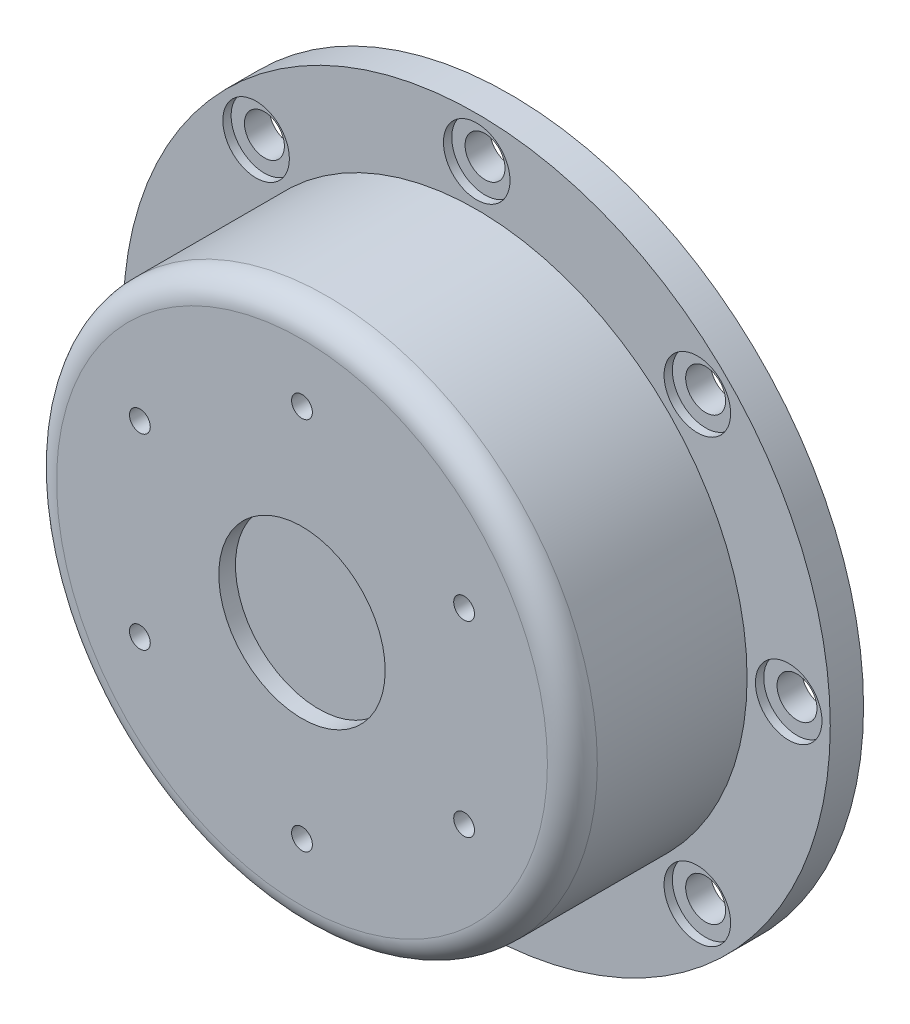
ISO-10303-21;
HEADER;
FILE_DESCRIPTION(('STEP AP214'),'2;1');
FILE_NAME('part.step','',(''),(''),'','','');
FILE_SCHEMA(('AUTOMOTIVE_DESIGN { 1 0 10303 214 1 1 1 1 }'));
ENDSEC;
DATA;
#1=APPLICATION_CONTEXT('core data for automotive mechanical design processes');
#2=APPLICATION_PROTOCOL_DEFINITION('international standard','automotive_design',2000,#1);
#3=PRODUCT_CONTEXT('',#1,'mechanical');
#4=PRODUCT('Part','Part','',(#3));
#5=PRODUCT_RELATED_PRODUCT_CATEGORY('part','',(#4));
#6=PRODUCT_DEFINITION_FORMATION('','',#4);
#7=PRODUCT_DEFINITION_CONTEXT('part definition',#1,'design');
#8=PRODUCT_DEFINITION('design','',#6,#7);
#9=PRODUCT_DEFINITION_SHAPE('','',#8);
#10=(LENGTH_UNIT() NAMED_UNIT(*) SI_UNIT(.MILLI.,.METRE.));
#11=(NAMED_UNIT(*) PLANE_ANGLE_UNIT() SI_UNIT($,.RADIAN.));
#12=(NAMED_UNIT(*) SI_UNIT($,.STERADIAN.) SOLID_ANGLE_UNIT());
#13=UNCERTAINTY_MEASURE_WITH_UNIT(LENGTH_MEASURE(1.E-05),#10,'distance_accuracy_value','');
#14=(GEOMETRIC_REPRESENTATION_CONTEXT(3) GLOBAL_UNCERTAINTY_ASSIGNED_CONTEXT((#13)) GLOBAL_UNIT_ASSIGNED_CONTEXT((#10,
#11,#12)) REPRESENTATION_CONTEXT('',''));
#15=CARTESIAN_POINT('',(0.,0.,0.));
#16=DIRECTION('',(0.,0.,1.));
#17=DIRECTION('',(1.,0.,0.));
#18=AXIS2_PLACEMENT_3D('',#15,#16,#17);
#19=CARTESIAN_POINT('',(0.,0.,25.));
#20=DIRECTION('',(0.,0.,-1.));
#21=DIRECTION('',(-1.,0.,0.));
#22=AXIS2_PLACEMENT_3D('',#19,#20,#21);
#23=CYLINDRICAL_SURFACE('',#22,42.5);
#24=CARTESIAN_POINT('',(0.,0.,0.));
#25=DIRECTION('',(0.,0.,1.));
#26=DIRECTION('',(1.,0.,0.));
#27=AXIS2_PLACEMENT_3D('',#24,#25,#26);
#28=CIRCLE('',#27,42.5);
#29=CARTESIAN_POINT('',(42.5,0.,0.));
#30=VERTEX_POINT('',#29);
#31=EDGE_CURVE('E204',#30,#30,#28,.T.);
#32=ORIENTED_EDGE('',*,*,#31,.T.);
#33=EDGE_LOOP('',(#32));
#34=FACE_BOUND('',#33,.T.);
#35=CARTESIAN_POINT('',(0.,0.,4.));
#36=DIRECTION('',(0.,0.,1.));
#37=DIRECTION('',(1.,0.,0.));
#38=AXIS2_PLACEMENT_3D('',#35,#36,#37);
#39=CIRCLE('',#38,42.5);
#40=CARTESIAN_POINT('',(42.5,0.,4.));
#41=VERTEX_POINT('',#40);
#42=EDGE_CURVE('E203',#41,#41,#39,.T.);
#43=ORIENTED_EDGE('',*,*,#42,.F.);
#44=EDGE_LOOP('',(#43));
#45=FACE_BOUND('',#44,.T.);
#46=ADVANCED_FACE('F42',(#34,#45),#23,.T.);
#47=CARTESIAN_POINT('',(0.,0.,0.));
#48=DIRECTION('',(0.,0.,1.));
#49=DIRECTION('',(1.,0.,0.));
#50=AXIS2_PLACEMENT_3D('',#47,#48,#49);
#51=PLANE('',#50);
#52=CARTESIAN_POINT('',(-26.5165042944952,26.5165042944959,0.));
#53=DIRECTION('',(0.,0.,1.));
#54=DIRECTION('',(1.,0.,0.));
#55=AXIS2_PLACEMENT_3D('',#52,#53,#54);
#56=CIRCLE('',#55,2.4);
#57=CARTESIAN_POINT('',(-24.1165042944952,26.5165042944959,0.));
#58=VERTEX_POINT('',#57);
#59=EDGE_CURVE('E129',#58,#58,#56,.T.);
#60=ORIENTED_EDGE('',*,*,#59,.T.);
#61=EDGE_LOOP('',(#60));
#62=FACE_BOUND('',#61,.T.);
#63=CARTESIAN_POINT('',(-37.5,3.92791650619852E-13,0.));
#64=DIRECTION('',(0.,0.,1.));
#65=DIRECTION('',(1.,0.,0.));
#66=AXIS2_PLACEMENT_3D('',#63,#64,#65);
#67=CIRCLE('',#66,2.4);
#68=CARTESIAN_POINT('',(-35.1,3.92791650619852E-13,0.));
#69=VERTEX_POINT('',#68);
#70=EDGE_CURVE('E139',#69,#69,#67,.T.);
#71=ORIENTED_EDGE('',*,*,#70,.T.);
#72=EDGE_LOOP('',(#71));
#73=FACE_BOUND('',#72,.T.);
#74=CARTESIAN_POINT('',(-26.5165042944958,-26.5165042944953,0.));
#75=DIRECTION('',(0.,0.,1.));
#76=DIRECTION('',(1.,0.,0.));
#77=AXIS2_PLACEMENT_3D('',#74,#75,#76);
#78=CIRCLE('',#77,2.4);
#79=CARTESIAN_POINT('',(-24.1165042944958,-26.5165042944953,0.));
#80=VERTEX_POINT('',#79);
#81=EDGE_CURVE('E149',#80,#80,#78,.T.);
#82=ORIENTED_EDGE('',*,*,#81,.T.);
#83=EDGE_LOOP('',(#82));
#84=FACE_BOUND('',#83,.T.);
#85=CARTESIAN_POINT('',(0.,-37.5,0.));
#86=DIRECTION('',(0.,0.,1.));
#87=DIRECTION('',(1.,0.,0.));
#88=AXIS2_PLACEMENT_3D('',#85,#86,#87);
#89=CIRCLE('',#88,2.4);
#90=CARTESIAN_POINT('',(2.4,-37.5,0.));
#91=VERTEX_POINT('',#90);
#92=EDGE_CURVE('E159',#91,#91,#89,.T.);
#93=ORIENTED_EDGE('',*,*,#92,.T.);
#94=EDGE_LOOP('',(#93));
#95=FACE_BOUND('',#94,.T.);
#96=CARTESIAN_POINT('',(26.5165042944954,-26.5165042944957,0.));
#97=DIRECTION('',(0.,0.,1.));
#98=DIRECTION('',(1.,0.,0.));
#99=AXIS2_PLACEMENT_3D('',#96,#97,#98);
#100=CIRCLE('',#99,2.4);
#101=CARTESIAN_POINT('',(28.9165042944954,-26.5165042944957,0.));
#102=VERTEX_POINT('',#101);
#103=EDGE_CURVE('E169',#102,#102,#100,.T.);
#104=ORIENTED_EDGE('',*,*,#103,.T.);
#105=EDGE_LOOP('',(#104));
#106=FACE_BOUND('',#105,.T.);
#107=CARTESIAN_POINT('',(37.5,-1.30930550206618E-13,0.));
#108=DIRECTION('',(0.,0.,1.));
#109=DIRECTION('',(1.,0.,0.));
#110=AXIS2_PLACEMENT_3D('',#107,#108,#109);
#111=CIRCLE('',#110,2.4);
#112=CARTESIAN_POINT('',(39.9,-1.30930550206618E-13,0.));
#113=VERTEX_POINT('',#112);
#114=EDGE_CURVE('E179',#113,#113,#111,.T.);
#115=ORIENTED_EDGE('',*,*,#114,.T.);
#116=EDGE_LOOP('',(#115));
#117=FACE_BOUND('',#116,.T.);
#118=CARTESIAN_POINT('',(26.5165042944956,26.5165042944955,0.));
#119=DIRECTION('',(0.,0.,1.));
#120=DIRECTION('',(1.,0.,0.));
#121=AXIS2_PLACEMENT_3D('',#118,#119,#120);
#122=CIRCLE('',#121,2.4);
#123=CARTESIAN_POINT('',(28.9165042944956,26.5165042944955,0.));
#124=VERTEX_POINT('',#123);
#125=EDGE_CURVE('E189',#124,#124,#122,.T.);
#126=ORIENTED_EDGE('',*,*,#125,.T.);
#127=EDGE_LOOP('',(#126));
#128=FACE_BOUND('',#127,.T.);
#129=CARTESIAN_POINT('',(0.,37.5,0.));
#130=DIRECTION('',(0.,0.,1.));
#131=DIRECTION('',(1.,0.,0.));
#132=AXIS2_PLACEMENT_3D('',#129,#130,#131);
#133=CIRCLE('',#132,2.4);
#134=CARTESIAN_POINT('',(2.4,37.5,0.));
#135=VERTEX_POINT('',#134);
#136=EDGE_CURVE('E199',#135,#135,#133,.T.);
#137=ORIENTED_EDGE('',*,*,#136,.T.);
#138=EDGE_LOOP('',(#137));
#139=FACE_BOUND('',#138,.T.);
#140=ORIENTED_EDGE('',*,*,#31,.F.);
#141=EDGE_LOOP('',(#140));
#142=FACE_BOUND('',#141,.T.);
#143=ADVANCED_FACE('F238',(#62,#73,#84,#95,#106,#117,#128,#139,#142),#51,.F.);
#144=CARTESIAN_POINT('',(0.,0.,4.));
#145=DIRECTION('',(0.,0.,1.));
#146=DIRECTION('',(1.,0.,0.));
#147=AXIS2_PLACEMENT_3D('',#144,#145,#146);
#148=PLANE('',#147);
#149=CARTESIAN_POINT('',(-26.5165042944952,26.5165042944959,4.));
#150=DIRECTION('',(0.,0.,1.));
#151=DIRECTION('',(1.,0.,0.));
#152=AXIS2_PLACEMENT_3D('',#149,#150,#151);
#153=CIRCLE('',#152,4.);
#154=CARTESIAN_POINT('',(-22.5165042944952,26.5165042944959,4.));
#155=VERTEX_POINT('',#154);
#156=EDGE_CURVE('E118',#155,#155,#153,.T.);
#157=ORIENTED_EDGE('',*,*,#156,.F.);
#158=EDGE_LOOP('',(#157));
#159=FACE_BOUND('',#158,.T.);
#160=CARTESIAN_POINT('',(-37.5,3.92791650619852E-13,4.));
#161=DIRECTION('',(0.,0.,1.));
#162=DIRECTION('',(1.,0.,0.));
#163=AXIS2_PLACEMENT_3D('',#160,#161,#162);
#164=CIRCLE('',#163,4.);
#165=CARTESIAN_POINT('',(-33.5,3.92791650619852E-13,4.));
#166=VERTEX_POINT('',#165);
#167=EDGE_CURVE('E130',#166,#166,#164,.T.);
#168=ORIENTED_EDGE('',*,*,#167,.F.);
#169=EDGE_LOOP('',(#168));
#170=FACE_BOUND('',#169,.T.);
#171=CARTESIAN_POINT('',(-26.5165042944958,-26.5165042944953,4.));
#172=DIRECTION('',(0.,0.,1.));
#173=DIRECTION('',(1.,0.,0.));
#174=AXIS2_PLACEMENT_3D('',#171,#172,#173);
#175=CIRCLE('',#174,4.);
#176=CARTESIAN_POINT('',(-22.5165042944958,-26.5165042944953,4.));
#177=VERTEX_POINT('',#176);
#178=EDGE_CURVE('E140',#177,#177,#175,.T.);
#179=ORIENTED_EDGE('',*,*,#178,.F.);
#180=EDGE_LOOP('',(#179));
#181=FACE_BOUND('',#180,.T.);
#182=CARTESIAN_POINT('',(0.,-37.5,4.));
#183=DIRECTION('',(0.,0.,1.));
#184=DIRECTION('',(1.,0.,0.));
#185=AXIS2_PLACEMENT_3D('',#182,#183,#184);
#186=CIRCLE('',#185,4.);
#187=CARTESIAN_POINT('',(4.,-37.5,4.));
#188=VERTEX_POINT('',#187);
#189=EDGE_CURVE('E150',#188,#188,#186,.T.);
#190=ORIENTED_EDGE('',*,*,#189,.F.);
#191=EDGE_LOOP('',(#190));
#192=FACE_BOUND('',#191,.T.);
#193=CARTESIAN_POINT('',(26.5165042944954,-26.5165042944957,4.));
#194=DIRECTION('',(0.,0.,1.));
#195=DIRECTION('',(1.,0.,0.));
#196=AXIS2_PLACEMENT_3D('',#193,#194,#195);
#197=CIRCLE('',#196,4.);
#198=CARTESIAN_POINT('',(30.5165042944954,-26.5165042944957,4.));
#199=VERTEX_POINT('',#198);
#200=EDGE_CURVE('E160',#199,#199,#197,.T.);
#201=ORIENTED_EDGE('',*,*,#200,.F.);
#202=EDGE_LOOP('',(#201));
#203=FACE_BOUND('',#202,.T.);
#204=CARTESIAN_POINT('',(37.5,-1.30930550206618E-13,4.));
#205=DIRECTION('',(0.,0.,1.));
#206=DIRECTION('',(1.,0.,0.));
#207=AXIS2_PLACEMENT_3D('',#204,#205,#206);
#208=CIRCLE('',#207,4.);
#209=CARTESIAN_POINT('',(41.5,-1.30930550206618E-13,4.));
#210=VERTEX_POINT('',#209);
#211=EDGE_CURVE('E170',#210,#210,#208,.T.);
#212=ORIENTED_EDGE('',*,*,#211,.F.);
#213=EDGE_LOOP('',(#212));
#214=FACE_BOUND('',#213,.T.);
#215=CARTESIAN_POINT('',(26.5165042944956,26.5165042944955,4.));
#216=DIRECTION('',(0.,0.,1.));
#217=DIRECTION('',(1.,0.,0.));
#218=AXIS2_PLACEMENT_3D('',#215,#216,#217);
#219=CIRCLE('',#218,4.);
#220=CARTESIAN_POINT('',(30.5165042944956,26.5165042944955,4.));
#221=VERTEX_POINT('',#220);
#222=EDGE_CURVE('E180',#221,#221,#219,.T.);
#223=ORIENTED_EDGE('',*,*,#222,.F.);
#224=EDGE_LOOP('',(#223));
#225=FACE_BOUND('',#224,.T.);
#226=CARTESIAN_POINT('',(0.,37.5,4.));
#227=DIRECTION('',(0.,0.,1.));
#228=DIRECTION('',(1.,0.,0.));
#229=AXIS2_PLACEMENT_3D('',#226,#227,#228);
#230=CIRCLE('',#229,4.);
#231=CARTESIAN_POINT('',(4.,37.5,4.));
#232=VERTEX_POINT('',#231);
#233=EDGE_CURVE('E190',#232,#232,#230,.T.);
#234=ORIENTED_EDGE('',*,*,#233,.F.);
#235=EDGE_LOOP('',(#234));
#236=FACE_BOUND('',#235,.T.);
#237=CARTESIAN_POINT('',(0.,0.,4.));
#238=DIRECTION('',(0.,0.,1.));
#239=DIRECTION('',(1.,0.,0.));
#240=AXIS2_PLACEMENT_3D('',#237,#238,#239);
#241=CIRCLE('',#240,32.5);
#242=CARTESIAN_POINT('',(32.5,0.,4.));
#243=VERTEX_POINT('',#242);
#244=EDGE_CURVE('E200',#243,#243,#241,.F.);
#245=ORIENTED_EDGE('',*,*,#244,.T.);
#246=EDGE_LOOP('',(#245));
#247=FACE_BOUND('',#246,.T.);
#248=ORIENTED_EDGE('',*,*,#42,.T.);
#249=EDGE_LOOP('',(#248));
#250=FACE_BOUND('',#249,.T.);
#251=ADVANCED_FACE('F243',(#159,#170,#181,#192,#203,#214,#225,#236,#247,#250),#148,.T.);
#252=CARTESIAN_POINT('',(0.,0.,-122.656836402186));
#253=DIRECTION('',(0.,0.,1.));
#254=DIRECTION('',(1.,0.,0.));
#255=AXIS2_PLACEMENT_3D('',#252,#253,#254);
#256=CYLINDRICAL_SURFACE('',#255,32.5);
#257=CARTESIAN_POINT('',(0.,0.,22.));
#258=DIRECTION('',(0.,0.,1.));
#259=DIRECTION('',(1.,0.,0.));
#260=AXIS2_PLACEMENT_3D('',#257,#258,#259);
#261=CIRCLE('',#260,32.5);
#262=CARTESIAN_POINT('',(32.5,0.,22.));
#263=VERTEX_POINT('',#262);
#264=EDGE_CURVE('E13',#263,#263,#261,.F.);
#265=ORIENTED_EDGE('',*,*,#264,.T.);
#266=EDGE_LOOP('',(#265));
#267=FACE_BOUND('',#266,.T.);
#268=ORIENTED_EDGE('',*,*,#244,.F.);
#269=EDGE_LOOP('',(#268));
#270=FACE_BOUND('',#269,.T.);
#271=ADVANCED_FACE('F251',(#267,#270),#256,.T.);
#272=CARTESIAN_POINT('',(0.,0.,25.));
#273=DIRECTION('',(0.,0.,1.));
#274=DIRECTION('',(1.,0.,0.));
#275=AXIS2_PLACEMENT_3D('',#272,#273,#274);
#276=PLANE('',#275);
#277=CARTESIAN_POINT('',(0.,0.,25.));
#278=DIRECTION('',(0.,0.,1.));
#279=DIRECTION('',(1.,0.,0.));
#280=AXIS2_PLACEMENT_3D('',#277,#278,#279);
#281=CIRCLE('',#280,29.5);
#282=CARTESIAN_POINT('',(29.5,0.,25.));
#283=VERTEX_POINT('',#282);
#284=EDGE_CURVE('E50',#283,#283,#281,.T.);
#285=ORIENTED_EDGE('',*,*,#284,.T.);
#286=EDGE_LOOP('',(#285));
#287=FACE_BOUND('',#286,.T.);
#288=CARTESIAN_POINT('',(-19.4855715851497,11.2500000000002,25.));
#289=DIRECTION('',(0.,0.,1.));
#290=DIRECTION('',(1.,0.,0.));
#291=AXIS2_PLACEMENT_3D('',#288,#289,#290);
#292=CIRCLE('',#291,1.24999999999999);
#293=CARTESIAN_POINT('',(-18.2355715851497,11.2500000000002,25.));
#294=VERTEX_POINT('',#293);
#295=EDGE_CURVE('E80',#294,#294,#292,.T.);
#296=ORIENTED_EDGE('',*,*,#295,.F.);
#297=EDGE_LOOP('',(#296));
#298=FACE_BOUND('',#297,.T.);
#299=CARTESIAN_POINT('',(-19.48557158515,-11.2499999999998,25.));
#300=DIRECTION('',(0.,0.,1.));
#301=DIRECTION('',(1.,0.,0.));
#302=AXIS2_PLACEMENT_3D('',#299,#300,#301);
#303=CIRCLE('',#302,1.24999999999999);
#304=CARTESIAN_POINT('',(-18.23557158515,-11.2499999999998,25.));
#305=VERTEX_POINT('',#304);
#306=EDGE_CURVE('E79',#305,#305,#303,.T.);
#307=ORIENTED_EDGE('',*,*,#306,.F.);
#308=EDGE_LOOP('',(#307));
#309=FACE_BOUND('',#308,.T.);
#310=CARTESIAN_POINT('',(0.,-22.5,25.));
#311=DIRECTION('',(0.,0.,1.));
#312=DIRECTION('',(1.,0.,0.));
#313=AXIS2_PLACEMENT_3D('',#310,#311,#312);
#314=CIRCLE('',#313,1.24999999999999);
#315=CARTESIAN_POINT('',(1.24999999999999,-22.5,25.));
#316=VERTEX_POINT('',#315);
#317=EDGE_CURVE('E90',#316,#316,#314,.T.);
#318=ORIENTED_EDGE('',*,*,#317,.F.);
#319=EDGE_LOOP('',(#318));
#320=FACE_BOUND('',#319,.T.);
#321=CARTESIAN_POINT('',(19.4855715851498,-11.2500000000001,25.));
#322=DIRECTION('',(0.,0.,1.));
#323=DIRECTION('',(1.,0.,0.));
#324=AXIS2_PLACEMENT_3D('',#321,#322,#323);
#325=CIRCLE('',#324,1.24999999999999);
#326=CARTESIAN_POINT('',(20.7355715851498,-11.2500000000001,25.));
#327=VERTEX_POINT('',#326);
#328=EDGE_CURVE('E96',#327,#327,#325,.T.);
#329=ORIENTED_EDGE('',*,*,#328,.F.);
#330=EDGE_LOOP('',(#329));
#331=FACE_BOUND('',#330,.T.);
#332=CARTESIAN_POINT('',(19.4855715851499,11.25,25.));
#333=DIRECTION('',(0.,0.,1.));
#334=DIRECTION('',(1.,0.,0.));
#335=AXIS2_PLACEMENT_3D('',#332,#333,#334);
#336=CIRCLE('',#335,1.24999999999999);
#337=CARTESIAN_POINT('',(20.7355715851499,11.25,25.));
#338=VERTEX_POINT('',#337);
#339=EDGE_CURVE('E102',#338,#338,#336,.T.);
#340=ORIENTED_EDGE('',*,*,#339,.F.);
#341=EDGE_LOOP('',(#340));
#342=FACE_BOUND('',#341,.T.);
#343=CARTESIAN_POINT('',(0.,22.5,25.));
#344=DIRECTION('',(0.,0.,1.));
#345=DIRECTION('',(1.,0.,0.));
#346=AXIS2_PLACEMENT_3D('',#343,#344,#345);
#347=CIRCLE('',#346,1.24999999999999);
#348=CARTESIAN_POINT('',(1.24999999999999,22.5,25.));
#349=VERTEX_POINT('',#348);
#350=EDGE_CURVE('E108',#349,#349,#347,.T.);
#351=ORIENTED_EDGE('',*,*,#350,.F.);
#352=EDGE_LOOP('',(#351));
#353=FACE_BOUND('',#352,.T.);
#354=CARTESIAN_POINT('',(0.,0.,25.));
#355=DIRECTION('',(0.,0.,1.));
#356=DIRECTION('',(1.,0.,0.));
#357=AXIS2_PLACEMENT_3D('',#354,#355,#356);
#358=CIRCLE('',#357,10.);
#359=CARTESIAN_POINT('',(10.,0.,25.));
#360=VERTEX_POINT('',#359);
#361=EDGE_CURVE('E114',#360,#360,#358,.T.);
#362=ORIENTED_EDGE('',*,*,#361,.F.);
#363=EDGE_LOOP('',(#362));
#364=FACE_BOUND('',#363,.T.);
#365=ADVANCED_FACE('F227',(#287,#298,#309,#320,#331,#342,#353,#364),#276,.T.);
#366=CARTESIAN_POINT('',(0.,37.5,4.));
#367=DIRECTION('',(0.,0.,1.));
#368=DIRECTION('',(1.,0.,0.));
#369=AXIS2_PLACEMENT_3D('',#366,#367,#368);
#370=CYLINDRICAL_SURFACE('',#369,2.4);
#371=CARTESIAN_POINT('',(0.,37.5,3.));
#372=DIRECTION('',(0.,0.,1.));
#373=DIRECTION('',(1.,0.,0.));
#374=AXIS2_PLACEMENT_3D('',#371,#372,#373);
#375=CIRCLE('',#374,2.4);
#376=CARTESIAN_POINT('',(2.4,37.5,3.));
#377=VERTEX_POINT('',#376);
#378=EDGE_CURVE('E196',#377,#377,#375,.T.);
#379=ORIENTED_EDGE('',*,*,#378,.T.);
#380=EDGE_LOOP('',(#379));
#381=FACE_BOUND('',#380,.T.);
#382=ORIENTED_EDGE('',*,*,#136,.F.);
#383=EDGE_LOOP('',(#382));
#384=FACE_BOUND('',#383,.T.);
#385=ADVANCED_FACE('F250',(#381,#384),#370,.F.);
#386=CARTESIAN_POINT('',(2.4,37.5,3.));
#387=DIRECTION('',(0.,0.,-1.));
#388=DIRECTION('',(-1.,0.,0.));
#389=AXIS2_PLACEMENT_3D('',#386,#387,#388);
#390=PLANE('',#389);
#391=ORIENTED_EDGE('',*,*,#378,.F.);
#392=EDGE_LOOP('',(#391));
#393=FACE_BOUND('',#392,.T.);
#394=CARTESIAN_POINT('',(0.,37.5,3.));
#395=DIRECTION('',(0.,0.,1.));
#396=DIRECTION('',(1.,0.,0.));
#397=AXIS2_PLACEMENT_3D('',#394,#395,#396);
#398=CIRCLE('',#397,4.);
#399=CARTESIAN_POINT('',(4.,37.5,3.));
#400=VERTEX_POINT('',#399);
#401=EDGE_CURVE('E193',#400,#400,#398,.T.);
#402=ORIENTED_EDGE('',*,*,#401,.T.);
#403=EDGE_LOOP('',(#402));
#404=FACE_BOUND('',#403,.T.);
#405=ADVANCED_FACE('F260',(#393,#404),#390,.F.);
#406=CARTESIAN_POINT('',(0.,37.5,4.));
#407=DIRECTION('',(0.,0.,1.));
#408=DIRECTION('',(1.,0.,0.));
#409=AXIS2_PLACEMENT_3D('',#406,#407,#408);
#410=CYLINDRICAL_SURFACE('',#409,4.);
#411=ORIENTED_EDGE('',*,*,#401,.F.);
#412=EDGE_LOOP('',(#411));
#413=FACE_BOUND('',#412,.T.);
#414=ORIENTED_EDGE('',*,*,#233,.T.);
#415=EDGE_LOOP('',(#414));
#416=FACE_BOUND('',#415,.T.);
#417=ADVANCED_FACE('F264',(#413,#416),#410,.F.);
#418=CARTESIAN_POINT('',(26.5165042944956,26.5165042944955,4.));
#419=DIRECTION('',(0.,0.,1.));
#420=DIRECTION('',(1.,0.,0.));
#421=AXIS2_PLACEMENT_3D('',#418,#419,#420);
#422=CYLINDRICAL_SURFACE('',#421,2.4);
#423=CARTESIAN_POINT('',(26.5165042944956,26.5165042944955,3.));
#424=DIRECTION('',(0.,0.,1.));
#425=DIRECTION('',(1.,0.,0.));
#426=AXIS2_PLACEMENT_3D('',#423,#424,#425);
#427=CIRCLE('',#426,2.4);
#428=CARTESIAN_POINT('',(28.9165042944956,26.5165042944955,3.));
#429=VERTEX_POINT('',#428);
#430=EDGE_CURVE('E186',#429,#429,#427,.T.);
#431=ORIENTED_EDGE('',*,*,#430,.T.);
#432=EDGE_LOOP('',(#431));
#433=FACE_BOUND('',#432,.T.);
#434=ORIENTED_EDGE('',*,*,#125,.F.);
#435=EDGE_LOOP('',(#434));
#436=FACE_BOUND('',#435,.T.);
#437=ADVANCED_FACE('F268',(#433,#436),#422,.F.);
#438=CARTESIAN_POINT('',(28.9165042944956,26.5165042944955,3.));
#439=DIRECTION('',(0.,0.,-1.));
#440=DIRECTION('',(-1.,0.,0.));
#441=AXIS2_PLACEMENT_3D('',#438,#439,#440);
#442=PLANE('',#441);
#443=ORIENTED_EDGE('',*,*,#430,.F.);
#444=EDGE_LOOP('',(#443));
#445=FACE_BOUND('',#444,.T.);
#446=CARTESIAN_POINT('',(26.5165042944956,26.5165042944955,3.));
#447=DIRECTION('',(0.,0.,1.));
#448=DIRECTION('',(1.,0.,0.));
#449=AXIS2_PLACEMENT_3D('',#446,#447,#448);
#450=CIRCLE('',#449,4.);
#451=CARTESIAN_POINT('',(30.5165042944956,26.5165042944955,3.));
#452=VERTEX_POINT('',#451);
#453=EDGE_CURVE('E183',#452,#452,#450,.T.);
#454=ORIENTED_EDGE('',*,*,#453,.T.);
#455=EDGE_LOOP('',(#454));
#456=FACE_BOUND('',#455,.T.);
#457=ADVANCED_FACE('F272',(#445,#456),#442,.F.);
#458=CARTESIAN_POINT('',(26.5165042944956,26.5165042944955,4.));
#459=DIRECTION('',(0.,0.,1.));
#460=DIRECTION('',(1.,0.,0.));
#461=AXIS2_PLACEMENT_3D('',#458,#459,#460);
#462=CYLINDRICAL_SURFACE('',#461,4.);
#463=ORIENTED_EDGE('',*,*,#453,.F.);
#464=EDGE_LOOP('',(#463));
#465=FACE_BOUND('',#464,.T.);
#466=ORIENTED_EDGE('',*,*,#222,.T.);
#467=EDGE_LOOP('',(#466));
#468=FACE_BOUND('',#467,.T.);
#469=ADVANCED_FACE('F276',(#465,#468),#462,.F.);
#470=CARTESIAN_POINT('',(37.5,-1.30930550206618E-13,4.));
#471=DIRECTION('',(0.,0.,1.));
#472=DIRECTION('',(1.,0.,0.));
#473=AXIS2_PLACEMENT_3D('',#470,#471,#472);
#474=CYLINDRICAL_SURFACE('',#473,2.4);
#475=CARTESIAN_POINT('',(37.5,-1.30930550206618E-13,3.));
#476=DIRECTION('',(0.,0.,1.));
#477=DIRECTION('',(1.,0.,0.));
#478=AXIS2_PLACEMENT_3D('',#475,#476,#477);
#479=CIRCLE('',#478,2.4);
#480=CARTESIAN_POINT('',(39.9,-1.30930550206618E-13,3.));
#481=VERTEX_POINT('',#480);
#482=EDGE_CURVE('E176',#481,#481,#479,.T.);
#483=ORIENTED_EDGE('',*,*,#482,.T.);
#484=EDGE_LOOP('',(#483));
#485=FACE_BOUND('',#484,.T.);
#486=ORIENTED_EDGE('',*,*,#114,.F.);
#487=EDGE_LOOP('',(#486));
#488=FACE_BOUND('',#487,.T.);
#489=ADVANCED_FACE('F280',(#485,#488),#474,.F.);
#490=CARTESIAN_POINT('',(39.9,-1.30930550206618E-13,3.));
#491=DIRECTION('',(0.,0.,-1.));
#492=DIRECTION('',(-1.,0.,0.));
#493=AXIS2_PLACEMENT_3D('',#490,#491,#492);
#494=PLANE('',#493);
#495=ORIENTED_EDGE('',*,*,#482,.F.);
#496=EDGE_LOOP('',(#495));
#497=FACE_BOUND('',#496,.T.);
#498=CARTESIAN_POINT('',(37.5,-1.30930550206618E-13,3.));
#499=DIRECTION('',(0.,0.,1.));
#500=DIRECTION('',(1.,0.,0.));
#501=AXIS2_PLACEMENT_3D('',#498,#499,#500);
#502=CIRCLE('',#501,4.);
#503=CARTESIAN_POINT('',(41.5,-1.30930550206618E-13,3.));
#504=VERTEX_POINT('',#503);
#505=EDGE_CURVE('E173',#504,#504,#502,.T.);
#506=ORIENTED_EDGE('',*,*,#505,.T.);
#507=EDGE_LOOP('',(#506));
#508=FACE_BOUND('',#507,.T.);
#509=ADVANCED_FACE('F284',(#497,#508),#494,.F.);
#510=CARTESIAN_POINT('',(37.5,-1.30930550206618E-13,4.));
#511=DIRECTION('',(0.,0.,1.));
#512=DIRECTION('',(1.,0.,0.));
#513=AXIS2_PLACEMENT_3D('',#510,#511,#512);
#514=CYLINDRICAL_SURFACE('',#513,4.);
#515=ORIENTED_EDGE('',*,*,#505,.F.);
#516=EDGE_LOOP('',(#515));
#517=FACE_BOUND('',#516,.T.);
#518=ORIENTED_EDGE('',*,*,#211,.T.);
#519=EDGE_LOOP('',(#518));
#520=FACE_BOUND('',#519,.T.);
#521=ADVANCED_FACE('F288',(#517,#520),#514,.F.);
#522=CARTESIAN_POINT('',(26.5165042944954,-26.5165042944957,4.));
#523=DIRECTION('',(0.,0.,1.));
#524=DIRECTION('',(1.,0.,0.));
#525=AXIS2_PLACEMENT_3D('',#522,#523,#524);
#526=CYLINDRICAL_SURFACE('',#525,2.4);
#527=CARTESIAN_POINT('',(26.5165042944954,-26.5165042944957,3.));
#528=DIRECTION('',(0.,0.,1.));
#529=DIRECTION('',(1.,0.,0.));
#530=AXIS2_PLACEMENT_3D('',#527,#528,#529);
#531=CIRCLE('',#530,2.4);
#532=CARTESIAN_POINT('',(28.9165042944954,-26.5165042944957,3.));
#533=VERTEX_POINT('',#532);
#534=EDGE_CURVE('E166',#533,#533,#531,.T.);
#535=ORIENTED_EDGE('',*,*,#534,.T.);
#536=EDGE_LOOP('',(#535));
#537=FACE_BOUND('',#536,.T.);
#538=ORIENTED_EDGE('',*,*,#103,.F.);
#539=EDGE_LOOP('',(#538));
#540=FACE_BOUND('',#539,.T.);
#541=ADVANCED_FACE('F292',(#537,#540),#526,.F.);
#542=CARTESIAN_POINT('',(28.9165042944954,-26.5165042944957,3.));
#543=DIRECTION('',(0.,0.,-1.));
#544=DIRECTION('',(-1.,0.,0.));
#545=AXIS2_PLACEMENT_3D('',#542,#543,#544);
#546=PLANE('',#545);
#547=ORIENTED_EDGE('',*,*,#534,.F.);
#548=EDGE_LOOP('',(#547));
#549=FACE_BOUND('',#548,.T.);
#550=CARTESIAN_POINT('',(26.5165042944954,-26.5165042944957,3.));
#551=DIRECTION('',(0.,0.,1.));
#552=DIRECTION('',(1.,0.,0.));
#553=AXIS2_PLACEMENT_3D('',#550,#551,#552);
#554=CIRCLE('',#553,4.);
#555=CARTESIAN_POINT('',(30.5165042944954,-26.5165042944957,3.));
#556=VERTEX_POINT('',#555);
#557=EDGE_CURVE('E163',#556,#556,#554,.T.);
#558=ORIENTED_EDGE('',*,*,#557,.T.);
#559=EDGE_LOOP('',(#558));
#560=FACE_BOUND('',#559,.T.);
#561=ADVANCED_FACE('F296',(#549,#560),#546,.F.);
#562=CARTESIAN_POINT('',(26.5165042944954,-26.5165042944957,4.));
#563=DIRECTION('',(0.,0.,1.));
#564=DIRECTION('',(1.,0.,0.));
#565=AXIS2_PLACEMENT_3D('',#562,#563,#564);
#566=CYLINDRICAL_SURFACE('',#565,4.);
#567=ORIENTED_EDGE('',*,*,#557,.F.);
#568=EDGE_LOOP('',(#567));
#569=FACE_BOUND('',#568,.T.);
#570=ORIENTED_EDGE('',*,*,#200,.T.);
#571=EDGE_LOOP('',(#570));
#572=FACE_BOUND('',#571,.T.);
#573=ADVANCED_FACE('F300',(#569,#572),#566,.F.);
#574=CARTESIAN_POINT('',(0.,-37.5,4.));
#575=DIRECTION('',(0.,0.,1.));
#576=DIRECTION('',(1.,0.,0.));
#577=AXIS2_PLACEMENT_3D('',#574,#575,#576);
#578=CYLINDRICAL_SURFACE('',#577,2.4);
#579=CARTESIAN_POINT('',(0.,-37.5,3.));
#580=DIRECTION('',(0.,0.,1.));
#581=DIRECTION('',(1.,0.,0.));
#582=AXIS2_PLACEMENT_3D('',#579,#580,#581);
#583=CIRCLE('',#582,2.4);
#584=CARTESIAN_POINT('',(2.4,-37.5,3.));
#585=VERTEX_POINT('',#584);
#586=EDGE_CURVE('E156',#585,#585,#583,.T.);
#587=ORIENTED_EDGE('',*,*,#586,.T.);
#588=EDGE_LOOP('',(#587));
#589=FACE_BOUND('',#588,.T.);
#590=ORIENTED_EDGE('',*,*,#92,.F.);
#591=EDGE_LOOP('',(#590));
#592=FACE_BOUND('',#591,.T.);
#593=ADVANCED_FACE('F304',(#589,#592),#578,.F.);
#594=CARTESIAN_POINT('',(2.4,-37.5,3.));
#595=DIRECTION('',(0.,0.,-1.));
#596=DIRECTION('',(-1.,0.,0.));
#597=AXIS2_PLACEMENT_3D('',#594,#595,#596);
#598=PLANE('',#597);
#599=ORIENTED_EDGE('',*,*,#586,.F.);
#600=EDGE_LOOP('',(#599));
#601=FACE_BOUND('',#600,.T.);
#602=CARTESIAN_POINT('',(0.,-37.5,3.));
#603=DIRECTION('',(0.,0.,1.));
#604=DIRECTION('',(1.,0.,0.));
#605=AXIS2_PLACEMENT_3D('',#602,#603,#604);
#606=CIRCLE('',#605,4.);
#607=CARTESIAN_POINT('',(4.,-37.5,3.));
#608=VERTEX_POINT('',#607);
#609=EDGE_CURVE('E153',#608,#608,#606,.T.);
#610=ORIENTED_EDGE('',*,*,#609,.T.);
#611=EDGE_LOOP('',(#610));
#612=FACE_BOUND('',#611,.T.);
#613=ADVANCED_FACE('F308',(#601,#612),#598,.F.);
#614=CARTESIAN_POINT('',(0.,-37.5,4.));
#615=DIRECTION('',(0.,0.,1.));
#616=DIRECTION('',(1.,0.,0.));
#617=AXIS2_PLACEMENT_3D('',#614,#615,#616);
#618=CYLINDRICAL_SURFACE('',#617,4.);
#619=ORIENTED_EDGE('',*,*,#609,.F.);
#620=EDGE_LOOP('',(#619));
#621=FACE_BOUND('',#620,.T.);
#622=ORIENTED_EDGE('',*,*,#189,.T.);
#623=EDGE_LOOP('',(#622));
#624=FACE_BOUND('',#623,.T.);
#625=ADVANCED_FACE('F312',(#621,#624),#618,.F.);
#626=CARTESIAN_POINT('',(-26.5165042944958,-26.5165042944953,4.));
#627=DIRECTION('',(0.,0.,1.));
#628=DIRECTION('',(1.,0.,0.));
#629=AXIS2_PLACEMENT_3D('',#626,#627,#628);
#630=CYLINDRICAL_SURFACE('',#629,2.4);
#631=CARTESIAN_POINT('',(-26.5165042944958,-26.5165042944953,3.));
#632=DIRECTION('',(0.,0.,1.));
#633=DIRECTION('',(1.,0.,0.));
#634=AXIS2_PLACEMENT_3D('',#631,#632,#633);
#635=CIRCLE('',#634,2.4);
#636=CARTESIAN_POINT('',(-24.1165042944958,-26.5165042944953,3.));
#637=VERTEX_POINT('',#636);
#638=EDGE_CURVE('E146',#637,#637,#635,.T.);
#639=ORIENTED_EDGE('',*,*,#638,.T.);
#640=EDGE_LOOP('',(#639));
#641=FACE_BOUND('',#640,.T.);
#642=ORIENTED_EDGE('',*,*,#81,.F.);
#643=EDGE_LOOP('',(#642));
#644=FACE_BOUND('',#643,.T.);
#645=ADVANCED_FACE('F316',(#641,#644),#630,.F.);
#646=CARTESIAN_POINT('',(-24.1165042944958,-26.5165042944953,3.));
#647=DIRECTION('',(0.,0.,-1.));
#648=DIRECTION('',(-1.,0.,0.));
#649=AXIS2_PLACEMENT_3D('',#646,#647,#648);
#650=PLANE('',#649);
#651=ORIENTED_EDGE('',*,*,#638,.F.);
#652=EDGE_LOOP('',(#651));
#653=FACE_BOUND('',#652,.T.);
#654=CARTESIAN_POINT('',(-26.5165042944958,-26.5165042944953,3.));
#655=DIRECTION('',(0.,0.,1.));
#656=DIRECTION('',(1.,0.,0.));
#657=AXIS2_PLACEMENT_3D('',#654,#655,#656);
#658=CIRCLE('',#657,4.);
#659=CARTESIAN_POINT('',(-22.5165042944958,-26.5165042944953,3.));
#660=VERTEX_POINT('',#659);
#661=EDGE_CURVE('E143',#660,#660,#658,.T.);
#662=ORIENTED_EDGE('',*,*,#661,.T.);
#663=EDGE_LOOP('',(#662));
#664=FACE_BOUND('',#663,.T.);
#665=ADVANCED_FACE('F320',(#653,#664),#650,.F.);
#666=CARTESIAN_POINT('',(-26.5165042944958,-26.5165042944953,4.));
#667=DIRECTION('',(0.,0.,1.));
#668=DIRECTION('',(1.,0.,0.));
#669=AXIS2_PLACEMENT_3D('',#666,#667,#668);
#670=CYLINDRICAL_SURFACE('',#669,4.);
#671=ORIENTED_EDGE('',*,*,#661,.F.);
#672=EDGE_LOOP('',(#671));
#673=FACE_BOUND('',#672,.T.);
#674=ORIENTED_EDGE('',*,*,#178,.T.);
#675=EDGE_LOOP('',(#674));
#676=FACE_BOUND('',#675,.T.);
#677=ADVANCED_FACE('F324',(#673,#676),#670,.F.);
#678=CARTESIAN_POINT('',(-37.5,3.92791650619852E-13,4.));
#679=DIRECTION('',(0.,0.,1.));
#680=DIRECTION('',(1.,0.,0.));
#681=AXIS2_PLACEMENT_3D('',#678,#679,#680);
#682=CYLINDRICAL_SURFACE('',#681,2.4);
#683=CARTESIAN_POINT('',(-37.5,3.92791650619852E-13,3.));
#684=DIRECTION('',(0.,0.,1.));
#685=DIRECTION('',(1.,0.,0.));
#686=AXIS2_PLACEMENT_3D('',#683,#684,#685);
#687=CIRCLE('',#686,2.4);
#688=CARTESIAN_POINT('',(-35.1,3.92791650619852E-13,3.));
#689=VERTEX_POINT('',#688);
#690=EDGE_CURVE('E136',#689,#689,#687,.T.);
#691=ORIENTED_EDGE('',*,*,#690,.T.);
#692=EDGE_LOOP('',(#691));
#693=FACE_BOUND('',#692,.T.);
#694=ORIENTED_EDGE('',*,*,#70,.F.);
#695=EDGE_LOOP('',(#694));
#696=FACE_BOUND('',#695,.T.);
#697=ADVANCED_FACE('F328',(#693,#696),#682,.F.);
#698=CARTESIAN_POINT('',(-35.1,3.92791650619852E-13,3.));
#699=DIRECTION('',(0.,0.,-1.));
#700=DIRECTION('',(-1.,0.,0.));
#701=AXIS2_PLACEMENT_3D('',#698,#699,#700);
#702=PLANE('',#701);
#703=ORIENTED_EDGE('',*,*,#690,.F.);
#704=EDGE_LOOP('',(#703));
#705=FACE_BOUND('',#704,.T.);
#706=CARTESIAN_POINT('',(-37.5,3.92791650619852E-13,3.));
#707=DIRECTION('',(0.,0.,1.));
#708=DIRECTION('',(1.,0.,0.));
#709=AXIS2_PLACEMENT_3D('',#706,#707,#708);
#710=CIRCLE('',#709,4.);
#711=CARTESIAN_POINT('',(-33.5,3.92791650619852E-13,3.));
#712=VERTEX_POINT('',#711);
#713=EDGE_CURVE('E133',#712,#712,#710,.T.);
#714=ORIENTED_EDGE('',*,*,#713,.T.);
#715=EDGE_LOOP('',(#714));
#716=FACE_BOUND('',#715,.T.);
#717=ADVANCED_FACE('F332',(#705,#716),#702,.F.);
#718=CARTESIAN_POINT('',(-37.5,3.92791650619852E-13,4.));
#719=DIRECTION('',(0.,0.,1.));
#720=DIRECTION('',(1.,0.,0.));
#721=AXIS2_PLACEMENT_3D('',#718,#719,#720);
#722=CYLINDRICAL_SURFACE('',#721,4.);
#723=ORIENTED_EDGE('',*,*,#713,.F.);
#724=EDGE_LOOP('',(#723));
#725=FACE_BOUND('',#724,.T.);
#726=ORIENTED_EDGE('',*,*,#167,.T.);
#727=EDGE_LOOP('',(#726));
#728=FACE_BOUND('',#727,.T.);
#729=ADVANCED_FACE('F336',(#725,#728),#722,.F.);
#730=CARTESIAN_POINT('',(-26.5165042944952,26.5165042944959,4.));
#731=DIRECTION('',(0.,0.,1.));
#732=DIRECTION('',(1.,0.,0.));
#733=AXIS2_PLACEMENT_3D('',#730,#731,#732);
#734=CYLINDRICAL_SURFACE('',#733,2.4);
#735=CARTESIAN_POINT('',(-26.5165042944952,26.5165042944959,3.));
#736=DIRECTION('',(0.,0.,1.));
#737=DIRECTION('',(1.,0.,0.));
#738=AXIS2_PLACEMENT_3D('',#735,#736,#737);
#739=CIRCLE('',#738,2.4);
#740=CARTESIAN_POINT('',(-24.1165042944952,26.5165042944959,3.));
#741=VERTEX_POINT('',#740);
#742=EDGE_CURVE('E126',#741,#741,#739,.T.);
#743=ORIENTED_EDGE('',*,*,#742,.T.);
#744=EDGE_LOOP('',(#743));
#745=FACE_BOUND('',#744,.T.);
#746=ORIENTED_EDGE('',*,*,#59,.F.);
#747=EDGE_LOOP('',(#746));
#748=FACE_BOUND('',#747,.T.);
#749=ADVANCED_FACE('F340',(#745,#748),#734,.F.);
#750=CARTESIAN_POINT('',(-24.1165042944952,26.5165042944959,3.));
#751=DIRECTION('',(0.,0.,-1.));
#752=DIRECTION('',(-1.,0.,0.));
#753=AXIS2_PLACEMENT_3D('',#750,#751,#752);
#754=PLANE('',#753);
#755=ORIENTED_EDGE('',*,*,#742,.F.);
#756=EDGE_LOOP('',(#755));
#757=FACE_BOUND('',#756,.T.);
#758=CARTESIAN_POINT('',(-26.5165042944952,26.5165042944959,3.));
#759=DIRECTION('',(0.,0.,1.));
#760=DIRECTION('',(1.,0.,0.));
#761=AXIS2_PLACEMENT_3D('',#758,#759,#760);
#762=CIRCLE('',#761,4.);
#763=CARTESIAN_POINT('',(-22.5165042944952,26.5165042944959,3.));
#764=VERTEX_POINT('',#763);
#765=EDGE_CURVE('E123',#764,#764,#762,.T.);
#766=ORIENTED_EDGE('',*,*,#765,.T.);
#767=EDGE_LOOP('',(#766));
#768=FACE_BOUND('',#767,.T.);
#769=ADVANCED_FACE('F344',(#757,#768),#754,.F.);
#770=CARTESIAN_POINT('',(-26.5165042944952,26.5165042944959,4.));
#771=DIRECTION('',(0.,0.,1.));
#772=DIRECTION('',(1.,0.,0.));
#773=AXIS2_PLACEMENT_3D('',#770,#771,#772);
#774=CYLINDRICAL_SURFACE('',#773,4.);
#775=ORIENTED_EDGE('',*,*,#765,.F.);
#776=EDGE_LOOP('',(#775));
#777=FACE_BOUND('',#776,.T.);
#778=ORIENTED_EDGE('',*,*,#156,.T.);
#779=EDGE_LOOP('',(#778));
#780=FACE_BOUND('',#779,.T.);
#781=ADVANCED_FACE('F348',(#777,#780),#774,.F.);
#782=CARTESIAN_POINT('',(0.,0.,23.));
#783=DIRECTION('',(0.,0.,1.));
#784=DIRECTION('',(1.,0.,0.));
#785=AXIS2_PLACEMENT_3D('',#782,#783,#784);
#786=CYLINDRICAL_SURFACE('',#785,10.);
#787=CARTESIAN_POINT('',(0.,0.,23.));
#788=DIRECTION('',(0.,0.,1.));
#789=DIRECTION('',(1.,0.,0.));
#790=AXIS2_PLACEMENT_3D('',#787,#788,#789);
#791=CIRCLE('',#790,10.);
#792=CARTESIAN_POINT('',(10.,0.,23.));
#793=VERTEX_POINT('',#792);
#794=EDGE_CURVE('E115',#793,#793,#791,.T.);
#795=ORIENTED_EDGE('',*,*,#794,.F.);
#796=EDGE_LOOP('',(#795));
#797=FACE_BOUND('',#796,.T.);
#798=ORIENTED_EDGE('',*,*,#361,.T.);
#799=EDGE_LOOP('',(#798));
#800=FACE_BOUND('',#799,.T.);
#801=ADVANCED_FACE('F352',(#797,#800),#786,.F.);
#802=CARTESIAN_POINT('',(0.,0.,23.));
#803=DIRECTION('',(0.,0.,1.));
#804=DIRECTION('',(1.,0.,0.));
#805=AXIS2_PLACEMENT_3D('',#802,#803,#804);
#806=PLANE('',#805);
#807=ORIENTED_EDGE('',*,*,#794,.T.);
#808=EDGE_LOOP('',(#807));
#809=FACE_BOUND('',#808,.T.);
#810=ADVANCED_FACE('F356',(#809),#806,.T.);
#811=CARTESIAN_POINT('',(0.,22.5,18.5));
#812=DIRECTION('',(0.,0.,1.));
#813=DIRECTION('',(1.,0.,0.));
#814=AXIS2_PLACEMENT_3D('',#811,#812,#813);
#815=CONICAL_SURFACE('',#814,1.24999999999999,1.02974425867665);
#816=CARTESIAN_POINT('',(0.,22.5,17.7489242262156));
#817=VERTEX_POINT('',#816);
#818=VERTEX_LOOP('',#817);
#819=FACE_BOUND('',#818,.T.);
#820=CARTESIAN_POINT('',(0.,22.5,18.5));
#821=DIRECTION('',(0.,0.,1.));
#822=DIRECTION('',(1.,0.,0.));
#823=AXIS2_PLACEMENT_3D('',#820,#821,#822);
#824=CIRCLE('',#823,1.24999999999999);
#825=CARTESIAN_POINT('',(1.24999999999999,22.5,18.5));
#826=VERTEX_POINT('',#825);
#827=EDGE_CURVE('E111',#826,#826,#824,.T.);
#828=ORIENTED_EDGE('',*,*,#827,.T.);
#829=EDGE_LOOP('',(#828));
#830=FACE_BOUND('',#829,.T.);
#831=ADVANCED_FACE('F360',(#819,#830),#815,.F.);
#832=CARTESIAN_POINT('',(0.,22.5,25.));
#833=DIRECTION('',(0.,0.,1.));
#834=DIRECTION('',(1.,0.,0.));
#835=AXIS2_PLACEMENT_3D('',#832,#833,#834);
#836=CYLINDRICAL_SURFACE('',#835,1.24999999999999);
#837=ORIENTED_EDGE('',*,*,#827,.F.);
#838=EDGE_LOOP('',(#837));
#839=FACE_BOUND('',#838,.T.);
#840=ORIENTED_EDGE('',*,*,#350,.T.);
#841=EDGE_LOOP('',(#840));
#842=FACE_BOUND('',#841,.T.);
#843=ADVANCED_FACE('F364',(#839,#842),#836,.F.);
#844=CARTESIAN_POINT('',(19.4855715851499,11.25,18.5));
#845=DIRECTION('',(0.,0.,1.));
#846=DIRECTION('',(1.,0.,0.));
#847=AXIS2_PLACEMENT_3D('',#844,#845,#846);
#848=CONICAL_SURFACE('',#847,1.24999999999999,1.02974425867665);
#849=CARTESIAN_POINT('',(19.4855715851498,11.25,17.7489242262156));
#850=VERTEX_POINT('',#849);
#851=VERTEX_LOOP('',#850);
#852=FACE_BOUND('',#851,.T.);
#853=CARTESIAN_POINT('',(19.4855715851499,11.25,18.5));
#854=DIRECTION('',(0.,0.,1.));
#855=DIRECTION('',(1.,0.,0.));
#856=AXIS2_PLACEMENT_3D('',#853,#854,#855);
#857=CIRCLE('',#856,1.24999999999999);
#858=CARTESIAN_POINT('',(20.7355715851499,11.25,18.5));
#859=VERTEX_POINT('',#858);
#860=EDGE_CURVE('E105',#859,#859,#857,.T.);
#861=ORIENTED_EDGE('',*,*,#860,.T.);
#862=EDGE_LOOP('',(#861));
#863=FACE_BOUND('',#862,.T.);
#864=ADVANCED_FACE('F367',(#852,#863),#848,.F.);
#865=CARTESIAN_POINT('',(19.4855715851499,11.25,25.));
#866=DIRECTION('',(0.,0.,1.));
#867=DIRECTION('',(1.,0.,0.));
#868=AXIS2_PLACEMENT_3D('',#865,#866,#867);
#869=CYLINDRICAL_SURFACE('',#868,1.24999999999999);
#870=ORIENTED_EDGE('',*,*,#860,.F.);
#871=EDGE_LOOP('',(#870));
#872=FACE_BOUND('',#871,.T.);
#873=ORIENTED_EDGE('',*,*,#339,.T.);
#874=EDGE_LOOP('',(#873));
#875=FACE_BOUND('',#874,.T.);
#876=ADVANCED_FACE('F371',(#872,#875),#869,.F.);
#877=CARTESIAN_POINT('',(19.4855715851498,-11.2500000000001,18.5));
#878=DIRECTION('',(0.,0.,1.));
#879=DIRECTION('',(1.,0.,0.));
#880=AXIS2_PLACEMENT_3D('',#877,#878,#879);
#881=CONICAL_SURFACE('',#880,1.24999999999999,1.02974425867665);
#882=CARTESIAN_POINT('',(19.4855715851498,-11.2500000000001,17.7489242262156));
#883=VERTEX_POINT('',#882);
#884=VERTEX_LOOP('',#883);
#885=FACE_BOUND('',#884,.T.);
#886=CARTESIAN_POINT('',(19.4855715851498,-11.2500000000001,18.5));
#887=DIRECTION('',(0.,0.,1.));
#888=DIRECTION('',(1.,0.,0.));
#889=AXIS2_PLACEMENT_3D('',#886,#887,#888);
#890=CIRCLE('',#889,1.24999999999999);
#891=CARTESIAN_POINT('',(20.7355715851498,-11.2500000000001,18.5));
#892=VERTEX_POINT('',#891);
#893=EDGE_CURVE('E99',#892,#892,#890,.T.);
#894=ORIENTED_EDGE('',*,*,#893,.T.);
#895=EDGE_LOOP('',(#894));
#896=FACE_BOUND('',#895,.T.);
#897=ADVANCED_FACE('F374',(#885,#896),#881,.F.);
#898=CARTESIAN_POINT('',(19.4855715851498,-11.2500000000001,25.));
#899=DIRECTION('',(0.,0.,1.));
#900=DIRECTION('',(1.,0.,0.));
#901=AXIS2_PLACEMENT_3D('',#898,#899,#900);
#902=CYLINDRICAL_SURFACE('',#901,1.24999999999999);
#903=ORIENTED_EDGE('',*,*,#893,.F.);
#904=EDGE_LOOP('',(#903));
#905=FACE_BOUND('',#904,.T.);
#906=ORIENTED_EDGE('',*,*,#328,.T.);
#907=EDGE_LOOP('',(#906));
#908=FACE_BOUND('',#907,.T.);
#909=ADVANCED_FACE('F378',(#905,#908),#902,.F.);
#910=CARTESIAN_POINT('',(0.,-22.5,18.5));
#911=DIRECTION('',(0.,0.,1.));
#912=DIRECTION('',(1.,0.,0.));
#913=AXIS2_PLACEMENT_3D('',#910,#911,#912);
#914=CONICAL_SURFACE('',#913,1.24999999999999,1.02974425867665);
#915=CARTESIAN_POINT('',(0.,-22.5,17.7489242262156));
#916=VERTEX_POINT('',#915);
#917=VERTEX_LOOP('',#916);
#918=FACE_BOUND('',#917,.T.);
#919=CARTESIAN_POINT('',(0.,-22.5,18.5));
#920=DIRECTION('',(0.,0.,1.));
#921=DIRECTION('',(1.,0.,0.));
#922=AXIS2_PLACEMENT_3D('',#919,#920,#921);
#923=CIRCLE('',#922,1.24999999999999);
#924=CARTESIAN_POINT('',(1.24999999999999,-22.5,18.5));
#925=VERTEX_POINT('',#924);
#926=EDGE_CURVE('E93',#925,#925,#923,.T.);
#927=ORIENTED_EDGE('',*,*,#926,.T.);
#928=EDGE_LOOP('',(#927));
#929=FACE_BOUND('',#928,.T.);
#930=ADVANCED_FACE('F382',(#918,#929),#914,.F.);
#931=CARTESIAN_POINT('',(0.,-22.5,25.));
#932=DIRECTION('',(0.,0.,1.));
#933=DIRECTION('',(1.,0.,0.));
#934=AXIS2_PLACEMENT_3D('',#931,#932,#933);
#935=CYLINDRICAL_SURFACE('',#934,1.24999999999999);
#936=ORIENTED_EDGE('',*,*,#926,.F.);
#937=EDGE_LOOP('',(#936));
#938=FACE_BOUND('',#937,.T.);
#939=ORIENTED_EDGE('',*,*,#317,.T.);
#940=EDGE_LOOP('',(#939));
#941=FACE_BOUND('',#940,.T.);
#942=ADVANCED_FACE('F386',(#938,#941),#935,.F.);
#943=CARTESIAN_POINT('',(-19.48557158515,-11.2499999999998,18.5));
#944=DIRECTION('',(0.,0.,1.));
#945=DIRECTION('',(1.,0.,0.));
#946=AXIS2_PLACEMENT_3D('',#943,#944,#945);
#947=CONICAL_SURFACE('',#946,1.24999999999999,1.02974425867665);
#948=CARTESIAN_POINT('',(-19.48557158515,-11.2499999999998,17.7489242262156));
#949=VERTEX_POINT('',#948);
#950=VERTEX_LOOP('',#949);
#951=FACE_BOUND('',#950,.T.);
#952=CARTESIAN_POINT('',(-19.48557158515,-11.2499999999998,18.5));
#953=DIRECTION('',(0.,0.,1.));
#954=DIRECTION('',(1.,0.,0.));
#955=AXIS2_PLACEMENT_3D('',#952,#953,#954);
#956=CIRCLE('',#955,1.24999999999999);
#957=CARTESIAN_POINT('',(-18.23557158515,-11.2499999999998,18.5));
#958=VERTEX_POINT('',#957);
#959=EDGE_CURVE('E83',#958,#958,#956,.T.);
#960=ORIENTED_EDGE('',*,*,#959,.T.);
#961=EDGE_LOOP('',(#960));
#962=FACE_BOUND('',#961,.T.);
#963=ADVANCED_FACE('F390',(#951,#962),#947,.F.);
#964=CARTESIAN_POINT('',(-19.48557158515,-11.2499999999998,25.));
#965=DIRECTION('',(0.,0.,1.));
#966=DIRECTION('',(1.,0.,0.));
#967=AXIS2_PLACEMENT_3D('',#964,#965,#966);
#968=CYLINDRICAL_SURFACE('',#967,1.24999999999999);
#969=ORIENTED_EDGE('',*,*,#959,.F.);
#970=EDGE_LOOP('',(#969));
#971=FACE_BOUND('',#970,.T.);
#972=ORIENTED_EDGE('',*,*,#306,.T.);
#973=EDGE_LOOP('',(#972));
#974=FACE_BOUND('',#973,.T.);
#975=ADVANCED_FACE('F73',(#971,#974),#968,.F.);
#976=CARTESIAN_POINT('',(-19.4855715851497,11.2500000000002,18.5));
#977=DIRECTION('',(0.,0.,1.));
#978=DIRECTION('',(1.,0.,0.));
#979=AXIS2_PLACEMENT_3D('',#976,#977,#978);
#980=CONICAL_SURFACE('',#979,1.24999999999999,1.02974425867665);
#981=CARTESIAN_POINT('',(-19.4855715851498,11.2500000000002,17.7489242262156));
#982=VERTEX_POINT('',#981);
#983=VERTEX_LOOP('',#982);
#984=FACE_BOUND('',#983,.T.);
#985=CARTESIAN_POINT('',(-19.4855715851497,11.2500000000002,18.5));
#986=DIRECTION('',(0.,0.,1.));
#987=DIRECTION('',(1.,0.,0.));
#988=AXIS2_PLACEMENT_3D('',#985,#986,#987);
#989=CIRCLE('',#988,1.24999999999999);
#990=CARTESIAN_POINT('',(-18.2355715851497,11.2500000000002,18.5));
#991=VERTEX_POINT('',#990);
#992=EDGE_CURVE('E77',#991,#991,#989,.T.);
#993=ORIENTED_EDGE('',*,*,#992,.T.);
#994=EDGE_LOOP('',(#993));
#995=FACE_BOUND('',#994,.T.);
#996=ADVANCED_FACE('F69',(#984,#995),#980,.F.);
#997=CARTESIAN_POINT('',(-19.4855715851497,11.2500000000002,25.));
#998=DIRECTION('',(0.,0.,1.));
#999=DIRECTION('',(1.,0.,0.));
#1000=AXIS2_PLACEMENT_3D('',#997,#998,#999);
#1001=CYLINDRICAL_SURFACE('',#1000,1.24999999999999);
#1002=ORIENTED_EDGE('',*,*,#992,.F.);
#1003=EDGE_LOOP('',(#1002));
#1004=FACE_BOUND('',#1003,.T.);
#1005=ORIENTED_EDGE('',*,*,#295,.T.);
#1006=EDGE_LOOP('',(#1005));
#1007=FACE_BOUND('',#1006,.T.);
#1008=ADVANCED_FACE('F72',(#1004,#1007),#1001,.F.);
#1009=CARTESIAN_POINT('',(0.,0.,22.));
#1010=DIRECTION('',(0.,0.,1.));
#1011=DIRECTION('',(1.,0.,0.));
#1012=AXIS2_PLACEMENT_3D('',#1009,#1010,#1011);
#1013=TOROIDAL_SURFACE('',#1012,29.5,3.);
#1014=ORIENTED_EDGE('',*,*,#264,.F.);
#1015=EDGE_LOOP('',(#1014));
#1016=FACE_BOUND('',#1015,.T.);
#1017=ORIENTED_EDGE('',*,*,#284,.F.);
#1018=EDGE_LOOP('',(#1017));
#1019=FACE_BOUND('',#1018,.T.);
#1020=ADVANCED_FACE('F44',(#1016,#1019),#1013,.T.);
#1021=CLOSED_SHELL('',(#46,#143,#251,#271,#365,#385,#405,#417,#437,#457,#469,#489,#509,#521,
#541,#561,#573,#593,#613,#625,#645,#665,#677,#697,#717,#729,#749,#769,#781,#801,#810,#831,#843,
#864,#876,#897,#909,#930,#942,#963,#975,#996,#1008,#1020));
#1022=MANIFOLD_SOLID_BREP('B2',#1021);
#1023=ADVANCED_BREP_SHAPE_REPRESENTATION('',(#18,#1022),#14);
#1024=SHAPE_DEFINITION_REPRESENTATION(#9,#1023);
ENDSEC;
END-ISO-10303-21;
